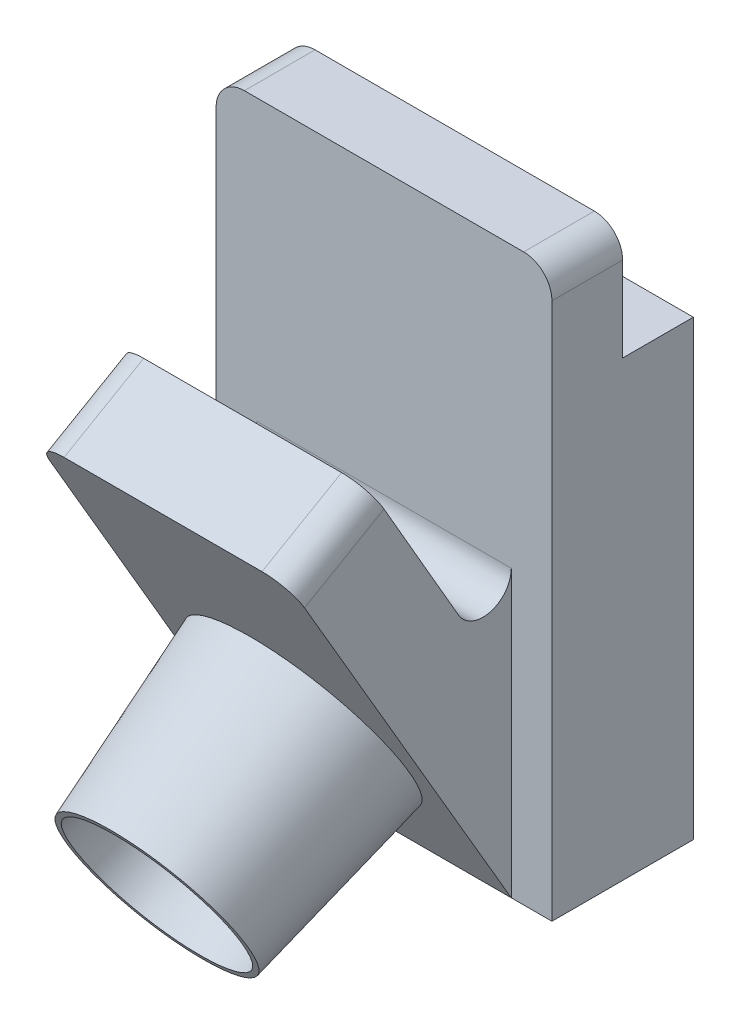
ISO-10303-21;
HEADER;
FILE_DESCRIPTION(('STEP AP214'),'2;1');
FILE_NAME('part.step','',(''),(''),'','','');
FILE_SCHEMA(('AUTOMOTIVE_DESIGN { 1 0 10303 214 1 1 1 1 }'));
ENDSEC;
DATA;
#1=APPLICATION_CONTEXT('core data for automotive mechanical design processes');
#2=APPLICATION_PROTOCOL_DEFINITION('international standard','automotive_design',2000,#1);
#3=PRODUCT_CONTEXT('',#1,'mechanical');
#4=PRODUCT('Part','Part','',(#3));
#5=PRODUCT_RELATED_PRODUCT_CATEGORY('part','',(#4));
#6=PRODUCT_DEFINITION_FORMATION('','',#4);
#7=PRODUCT_DEFINITION_CONTEXT('part definition',#1,'design');
#8=PRODUCT_DEFINITION('design','',#6,#7);
#9=PRODUCT_DEFINITION_SHAPE('','',#8);
#10=(LENGTH_UNIT() NAMED_UNIT(*) SI_UNIT(.MILLI.,.METRE.));
#11=(NAMED_UNIT(*) PLANE_ANGLE_UNIT() SI_UNIT($,.RADIAN.));
#12=(NAMED_UNIT(*) SI_UNIT($,.STERADIAN.) SOLID_ANGLE_UNIT());
#13=UNCERTAINTY_MEASURE_WITH_UNIT(LENGTH_MEASURE(1.E-05),#10,'distance_accuracy_value','');
#14=(GEOMETRIC_REPRESENTATION_CONTEXT(3) GLOBAL_UNCERTAINTY_ASSIGNED_CONTEXT((#13)) GLOBAL_UNIT_ASSIGNED_CONTEXT((#10,
#11,#12)) REPRESENTATION_CONTEXT('',''));
#15=CARTESIAN_POINT('',(0.,0.,0.));
#16=DIRECTION('',(0.,0.,1.));
#17=DIRECTION('',(1.,0.,0.));
#18=AXIS2_PLACEMENT_3D('',#15,#16,#17);
#19=CARTESIAN_POINT('',(0.,0.,5.));
#20=DIRECTION('',(0.,0.,-1.));
#21=DIRECTION('',(-1.,0.,0.));
#22=AXIS2_PLACEMENT_3D('',#19,#20,#21);
#23=PLANE('',#22);
#24=DIRECTION('',(1.,0.,0.));
#25=VECTOR('',#24,1.);
#26=CARTESIAN_POINT('',(0.,4.18632312078236,5.));
#27=LINE('',#26,#25);
#28=CARTESIAN_POINT('',(-9.,4.18632312078236,5.));
#29=VERTEX_POINT('',#28);
#30=CARTESIAN_POINT('',(9.,4.18632312078236,5.));
#31=VERTEX_POINT('',#30);
#32=EDGE_CURVE('E237',#29,#31,#27,.T.);
#33=ORIENTED_EDGE('',*,*,#32,.T.);
#34=DIRECTION('',(0.,1.,0.));
#35=VECTOR('',#34,1.);
#36=CARTESIAN_POINT('',(9.,-16.,5.));
#37=LINE('',#36,#35);
#38=CARTESIAN_POINT('',(9.,-16.,5.));
#39=VERTEX_POINT('',#38);
#40=EDGE_CURVE('E163',#39,#31,#37,.T.);
#41=ORIENTED_EDGE('',*,*,#40,.F.);
#42=DIRECTION('',(1.,0.,0.));
#43=VECTOR('',#42,1.);
#44=CARTESIAN_POINT('',(-11.875,-16.,5.));
#45=LINE('',#44,#43);
#46=CARTESIAN_POINT('',(11.875,-16.,5.));
#47=VERTEX_POINT('',#46);
#48=EDGE_CURVE('E190',#39,#47,#45,.T.);
#49=ORIENTED_EDGE('',*,*,#48,.T.);
#50=DIRECTION('',(0.,1.,0.));
#51=VECTOR('',#50,1.);
#52=CARTESIAN_POINT('',(11.875,-16.,5.));
#53=LINE('',#52,#51);
#54=CARTESIAN_POINT('',(11.875,22.,5.));
#55=VERTEX_POINT('',#54);
#56=EDGE_CURVE('E195',#47,#55,#53,.T.);
#57=ORIENTED_EDGE('',*,*,#56,.T.);
#58=CARTESIAN_POINT('',(9.875,22.,5.));
#59=DIRECTION('',(0.,0.,-1.));
#60=DIRECTION('',(-1.,0.,0.));
#61=AXIS2_PLACEMENT_3D('',#58,#59,#60);
#62=CIRCLE('',#61,2.);
#63=CARTESIAN_POINT('',(9.875,24.,5.));
#64=VERTEX_POINT('',#63);
#65=EDGE_CURVE('E226',#55,#64,#62,.F.);
#66=ORIENTED_EDGE('',*,*,#65,.T.);
#67=DIRECTION('',(-1.,0.,0.));
#68=VECTOR('',#67,1.);
#69=CARTESIAN_POINT('',(-11.875,24.,5.));
#70=LINE('',#69,#68);
#71=CARTESIAN_POINT('',(-9.875,24.,5.));
#72=VERTEX_POINT('',#71);
#73=EDGE_CURVE('E198',#64,#72,#70,.T.);
#74=ORIENTED_EDGE('',*,*,#73,.T.);
#75=CARTESIAN_POINT('',(-9.875,22.,5.));
#76=DIRECTION('',(0.,0.,-1.));
#77=DIRECTION('',(-1.,0.,0.));
#78=AXIS2_PLACEMENT_3D('',#75,#76,#77);
#79=CIRCLE('',#78,2.);
#80=CARTESIAN_POINT('',(-11.875,22.,5.));
#81=VERTEX_POINT('',#80);
#82=EDGE_CURVE('E235',#72,#81,#79,.F.);
#83=ORIENTED_EDGE('',*,*,#82,.T.);
#84=DIRECTION('',(0.,-1.,0.));
#85=VECTOR('',#84,1.);
#86=CARTESIAN_POINT('',(-11.875,-16.,5.));
#87=LINE('',#86,#85);
#88=CARTESIAN_POINT('',(-11.875,-16.,5.));
#89=VERTEX_POINT('',#88);
#90=EDGE_CURVE('E188',#81,#89,#87,.T.);
#91=ORIENTED_EDGE('',*,*,#90,.T.);
#92=CARTESIAN_POINT('',(-9.,-16.,5.));
#93=VERTEX_POINT('',#92);
#94=EDGE_CURVE('E192',#89,#93,#45,.T.);
#95=ORIENTED_EDGE('',*,*,#94,.T.);
#96=DIRECTION('',(0.,1.,0.));
#97=VECTOR('',#96,1.);
#98=CARTESIAN_POINT('',(-9.,-16.,5.));
#99=LINE('',#98,#97);
#100=EDGE_CURVE('E165',#93,#29,#99,.T.);
#101=ORIENTED_EDGE('',*,*,#100,.T.);
#102=EDGE_LOOP('',(#33,#41,#49,#57,#66,#74,#83,#91,#95,#101));
#103=FACE_BOUND('',#102,.T.);
#104=ADVANCED_FACE('F34',(#103),#23,.F.);
#105=CARTESIAN_POINT('',(-11.875,16.,-5.));
#106=DIRECTION('',(-1.,0.,0.));
#107=DIRECTION('',(0.,-1.,0.));
#108=AXIS2_PLACEMENT_3D('',#105,#106,#107);
#109=PLANE('',#108);
#110=ORIENTED_EDGE('',*,*,#90,.F.);
#111=DIRECTION('',(0.,0.,-1.));
#112=VECTOR('',#111,1.);
#113=CARTESIAN_POINT('',(-11.875,22.,0.));
#114=LINE('',#113,#112);
#115=CARTESIAN_POINT('',(-11.875,22.,0.));
#116=VERTEX_POINT('',#115);
#117=EDGE_CURVE('E246',#81,#116,#114,.T.);
#118=ORIENTED_EDGE('',*,*,#117,.T.);
#119=DIRECTION('',(0.,-1.,0.));
#120=VECTOR('',#119,1.);
#121=CARTESIAN_POINT('',(-11.875,-16.,0.));
#122=LINE('',#121,#120);
#123=CARTESIAN_POINT('',(-11.875,16.,0.));
#124=VERTEX_POINT('',#123);
#125=EDGE_CURVE('E182',#116,#124,#122,.T.);
#126=ORIENTED_EDGE('',*,*,#125,.T.);
#127=DIRECTION('',(0.,0.,1.));
#128=VECTOR('',#127,1.);
#129=CARTESIAN_POINT('',(-11.875,16.,-5.));
#130=LINE('',#129,#128);
#131=CARTESIAN_POINT('',(-11.875,16.,-5.));
#132=VERTEX_POINT('',#131);
#133=EDGE_CURVE('E223',#132,#124,#130,.T.);
#134=ORIENTED_EDGE('',*,*,#133,.F.);
#135=DIRECTION('',(0.,-1.,0.));
#136=VECTOR('',#135,1.);
#137=CARTESIAN_POINT('',(-11.875,16.,-5.));
#138=LINE('',#137,#136);
#139=CARTESIAN_POINT('',(-11.875,-16.,-5.));
#140=VERTEX_POINT('',#139);
#141=EDGE_CURVE('E208',#132,#140,#138,.T.);
#142=ORIENTED_EDGE('',*,*,#141,.T.);
#143=DIRECTION('',(0.,0.,1.));
#144=VECTOR('',#143,1.);
#145=CARTESIAN_POINT('',(-11.875,-16.,-5.));
#146=LINE('',#145,#144);
#147=EDGE_CURVE('E220',#140,#89,#146,.T.);
#148=ORIENTED_EDGE('',*,*,#147,.T.);
#149=EDGE_LOOP('',(#110,#118,#126,#134,#142,#148));
#150=FACE_BOUND('',#149,.T.);
#151=ADVANCED_FACE('F303',(#150),#109,.T.);
#152=CARTESIAN_POINT('',(11.875,16.,-5.));
#153=DIRECTION('',(0.,1.,0.));
#154=DIRECTION('',(0.,0.,1.));
#155=AXIS2_PLACEMENT_3D('',#152,#153,#154);
#156=PLANE('',#155);
#157=DIRECTION('',(-1.,0.,0.));
#158=VECTOR('',#157,1.);
#159=CARTESIAN_POINT('',(11.875,16.,0.));
#160=LINE('',#159,#158);
#161=CARTESIAN_POINT('',(11.875,16.,0.));
#162=VERTEX_POINT('',#161);
#163=EDGE_CURVE('E201',#162,#124,#160,.T.);
#164=ORIENTED_EDGE('',*,*,#163,.F.);
#165=DIRECTION('',(0.,0.,1.));
#166=VECTOR('',#165,1.);
#167=CARTESIAN_POINT('',(11.875,16.,-5.));
#168=LINE('',#167,#166);
#169=CARTESIAN_POINT('',(11.875,16.,-5.));
#170=VERTEX_POINT('',#169);
#171=EDGE_CURVE('E227',#170,#162,#168,.T.);
#172=ORIENTED_EDGE('',*,*,#171,.F.);
#173=DIRECTION('',(-1.,0.,0.));
#174=VECTOR('',#173,1.);
#175=CARTESIAN_POINT('',(11.875,16.,-5.));
#176=LINE('',#175,#174);
#177=EDGE_CURVE('E217',#170,#132,#176,.T.);
#178=ORIENTED_EDGE('',*,*,#177,.T.);
#179=ORIENTED_EDGE('',*,*,#133,.T.);
#180=EDGE_LOOP('',(#164,#172,#178,#179));
#181=FACE_BOUND('',#180,.T.);
#182=ADVANCED_FACE('F309',(#181),#156,.T.);
#183=CARTESIAN_POINT('',(11.875,16.,-5.));
#184=DIRECTION('',(1.,0.,0.));
#185=DIRECTION('',(0.,1.,0.));
#186=AXIS2_PLACEMENT_3D('',#183,#184,#185);
#187=PLANE('',#186);
#188=DIRECTION('',(0.,1.,0.));
#189=VECTOR('',#188,1.);
#190=CARTESIAN_POINT('',(11.875,-16.,0.));
#191=LINE('',#190,#189);
#192=CARTESIAN_POINT('',(11.875,22.,0.));
#193=VERTEX_POINT('',#192);
#194=EDGE_CURVE('E203',#162,#193,#191,.T.);
#195=ORIENTED_EDGE('',*,*,#194,.T.);
#196=DIRECTION('',(0.,0.,-1.));
#197=VECTOR('',#196,1.);
#198=CARTESIAN_POINT('',(11.875,22.,5.));
#199=LINE('',#198,#197);
#200=EDGE_CURVE('E258',#193,#55,#199,.F.);
#201=ORIENTED_EDGE('',*,*,#200,.T.);
#202=ORIENTED_EDGE('',*,*,#56,.F.);
#203=DIRECTION('',(0.,0.,1.));
#204=VECTOR('',#203,1.);
#205=CARTESIAN_POINT('',(11.875,-16.,-5.));
#206=LINE('',#205,#204);
#207=CARTESIAN_POINT('',(11.875,-16.,-5.));
#208=VERTEX_POINT('',#207);
#209=EDGE_CURVE('E229',#208,#47,#206,.T.);
#210=ORIENTED_EDGE('',*,*,#209,.F.);
#211=DIRECTION('',(0.,1.,0.));
#212=VECTOR('',#211,1.);
#213=CARTESIAN_POINT('',(11.875,16.,-5.));
#214=LINE('',#213,#212);
#215=EDGE_CURVE('E214',#208,#170,#214,.T.);
#216=ORIENTED_EDGE('',*,*,#215,.T.);
#217=ORIENTED_EDGE('',*,*,#171,.T.);
#218=EDGE_LOOP('',(#195,#201,#202,#210,#216,#217));
#219=FACE_BOUND('',#218,.T.);
#220=ADVANCED_FACE('F330',(#219),#187,.T.);
#221=CARTESIAN_POINT('',(11.875,-16.,-5.));
#222=DIRECTION('',(0.,-1.,0.));
#223=DIRECTION('',(0.,0.,-1.));
#224=AXIS2_PLACEMENT_3D('',#221,#222,#223);
#225=PLANE('',#224);
#226=ORIENTED_EDGE('',*,*,#209,.T.);
#227=ORIENTED_EDGE('',*,*,#48,.F.);
#228=DIRECTION('',(1.,0.,0.));
#229=VECTOR('',#228,1.);
#230=CARTESIAN_POINT('',(-9.,-16.,5.));
#231=LINE('',#230,#229);
#232=EDGE_CURVE('E179',#93,#39,#231,.T.);
#233=ORIENTED_EDGE('',*,*,#232,.F.);
#234=ORIENTED_EDGE('',*,*,#94,.F.);
#235=ORIENTED_EDGE('',*,*,#147,.F.);
#236=DIRECTION('',(1.,0.,0.));
#237=VECTOR('',#236,1.);
#238=CARTESIAN_POINT('',(11.875,-16.,-5.));
#239=LINE('',#238,#237);
#240=EDGE_CURVE('E211',#140,#208,#239,.T.);
#241=ORIENTED_EDGE('',*,*,#240,.T.);
#242=EDGE_LOOP('',(#226,#227,#233,#234,#235,#241));
#243=FACE_BOUND('',#242,.T.);
#244=ADVANCED_FACE('F326',(#243),#225,.T.);
#245=CARTESIAN_POINT('',(0.,0.,-5.));
#246=DIRECTION('',(0.,0.,-1.));
#247=DIRECTION('',(-1.,0.,0.));
#248=AXIS2_PLACEMENT_3D('',#245,#246,#247);
#249=PLANE('',#248);
#250=ORIENTED_EDGE('',*,*,#141,.F.);
#251=ORIENTED_EDGE('',*,*,#177,.F.);
#252=ORIENTED_EDGE('',*,*,#215,.F.);
#253=ORIENTED_EDGE('',*,*,#240,.F.);
#254=EDGE_LOOP('',(#250,#251,#252,#253));
#255=FACE_BOUND('',#254,.T.);
#256=ADVANCED_FACE('F322',(#255),#249,.T.);
#257=CARTESIAN_POINT('',(-11.875,24.,5.));
#258=DIRECTION('',(0.,-1.,0.));
#259=DIRECTION('',(0.,0.,-1.));
#260=AXIS2_PLACEMENT_3D('',#257,#258,#259);
#261=PLANE('',#260);
#262=DIRECTION('',(-1.,0.,0.));
#263=VECTOR('',#262,1.);
#264=CARTESIAN_POINT('',(-11.875,24.,0.));
#265=LINE('',#264,#263);
#266=CARTESIAN_POINT('',(9.875,24.,0.));
#267=VERTEX_POINT('',#266);
#268=CARTESIAN_POINT('',(-9.875,24.,0.));
#269=VERTEX_POINT('',#268);
#270=EDGE_CURVE('E191',#267,#269,#265,.T.);
#271=ORIENTED_EDGE('',*,*,#270,.T.);
#272=DIRECTION('',(0.,0.,-1.));
#273=VECTOR('',#272,1.);
#274=CARTESIAN_POINT('',(-9.875,24.,5.));
#275=LINE('',#274,#273);
#276=EDGE_CURVE('E256',#269,#72,#275,.F.);
#277=ORIENTED_EDGE('',*,*,#276,.T.);
#278=ORIENTED_EDGE('',*,*,#73,.F.);
#279=DIRECTION('',(0.,0.,-1.));
#280=VECTOR('',#279,1.);
#281=CARTESIAN_POINT('',(9.875,24.,0.));
#282=LINE('',#281,#280);
#283=EDGE_CURVE('E253',#64,#267,#282,.T.);
#284=ORIENTED_EDGE('',*,*,#283,.T.);
#285=EDGE_LOOP('',(#271,#277,#278,#284));
#286=FACE_BOUND('',#285,.T.);
#287=ADVANCED_FACE('F318',(#286),#261,.F.);
#288=CARTESIAN_POINT('',(0.,0.,0.));
#289=DIRECTION('',(0.,0.,-1.));
#290=DIRECTION('',(-1.,0.,0.));
#291=AXIS2_PLACEMENT_3D('',#288,#289,#290);
#292=PLANE('',#291);
#293=ORIENTED_EDGE('',*,*,#125,.F.);
#294=CARTESIAN_POINT('',(-9.875,22.,0.));
#295=DIRECTION('',(0.,0.,-1.));
#296=DIRECTION('',(-1.,0.,0.));
#297=AXIS2_PLACEMENT_3D('',#294,#295,#296);
#298=CIRCLE('',#297,2.);
#299=EDGE_CURVE('E251',#116,#269,#298,.T.);
#300=ORIENTED_EDGE('',*,*,#299,.T.);
#301=ORIENTED_EDGE('',*,*,#270,.F.);
#302=CARTESIAN_POINT('',(9.875,22.,0.));
#303=DIRECTION('',(0.,0.,-1.));
#304=DIRECTION('',(-1.,0.,0.));
#305=AXIS2_PLACEMENT_3D('',#302,#303,#304);
#306=CIRCLE('',#305,2.);
#307=EDGE_CURVE('E249',#267,#193,#306,.T.);
#308=ORIENTED_EDGE('',*,*,#307,.T.);
#309=ORIENTED_EDGE('',*,*,#194,.F.);
#310=ORIENTED_EDGE('',*,*,#163,.T.);
#311=EDGE_LOOP('',(#293,#300,#301,#308,#309,#310));
#312=FACE_BOUND('',#311,.T.);
#313=ADVANCED_FACE('F315',(#312),#292,.T.);
#314=CARTESIAN_POINT('',(-9.,10.7927295813334,20.6291651245988));
#315=DIRECTION('',(0.,-0.50387277832175,0.863777878430746));
#316=DIRECTION('',(0.,-0.863777878430746,-0.50387277832175));
#317=AXIS2_PLACEMENT_3D('',#314,#315,#316);
#318=PLANE('',#317);
#319=CARTESIAN_POINT('',(0.,-6.2383752250277,10.6943076676559));
#320=DIRECTION('',(0.,-0.50387277832175,0.863777878430746));
#321=DIRECTION('',(0.,-0.863777878430746,-0.50387277832175));
#322=AXIS2_PLACEMENT_3D('',#319,#320,#321);
#323=CIRCLE('',#322,7.5);
#324=CARTESIAN_POINT('',(0.,-12.7167093132583,6.91526183024274));
#325=VERTEX_POINT('',#324);
#326=EDGE_CURVE('E156',#325,#325,#323,.T.);
#327=ORIENTED_EDGE('',*,*,#326,.F.);
#328=EDGE_LOOP('',(#327));
#329=FACE_BOUND('',#328,.T.);
#330=DIRECTION('',(1.,0.,0.));
#331=VECTOR('',#330,1.);
#332=CARTESIAN_POINT('',(-9.,10.7927295813334,20.6291651245988));
#333=LINE('',#332,#331);
#334=CARTESIAN_POINT('',(-7.,10.7927295813334,20.6291651245988));
#335=VERTEX_POINT('',#334);
#336=CARTESIAN_POINT('',(7.,10.7927295813334,20.6291651245988));
#337=VERTEX_POINT('',#336);
#338=EDGE_CURVE('E183',#335,#337,#333,.T.);
#339=ORIENTED_EDGE('',*,*,#338,.F.);
#340=CARTESIAN_POINT('',(-7.,9.06515650573998,19.6214094653146));
#341=DIRECTION('',(0.,-0.50387277832175,0.863777878430746));
#342=DIRECTION('',(0.,-0.863777878430746,-0.50387277832175));
#343=AXIS2_PLACEMENT_3D('',#340,#341,#342);
#344=ELLIPSE('',#343,2.00002004998314,2.);
#345=CARTESIAN_POINT('',(-9.,9.06515650573998,19.6214094653146));
#346=VERTEX_POINT('',#345);
#347=EDGE_CURVE('E49',#335,#346,#344,.T.);
#348=ORIENTED_EDGE('',*,*,#347,.T.);
#349=DIRECTION('',(0.,-0.863777878430746,-0.50387277832175));
#350=VECTOR('',#349,1.);
#351=CARTESIAN_POINT('',(-9.,10.7927295813334,20.6291651245988));
#352=LINE('',#351,#350);
#353=EDGE_CURVE('E171',#346,#93,#352,.T.);
#354=ORIENTED_EDGE('',*,*,#353,.T.);
#355=ORIENTED_EDGE('',*,*,#232,.T.);
#356=DIRECTION('',(0.,-0.863777878430746,-0.50387277832175));
#357=VECTOR('',#356,1.);
#358=CARTESIAN_POINT('',(9.,10.7927295813334,20.6291651245988));
#359=LINE('',#358,#357);
#360=CARTESIAN_POINT('',(9.,9.06515650573998,19.6214094653146));
#361=VERTEX_POINT('',#360);
#362=EDGE_CURVE('E168',#361,#39,#359,.T.);
#363=ORIENTED_EDGE('',*,*,#362,.F.);
#364=CARTESIAN_POINT('',(7.,9.06515650573998,19.6214094653146));
#365=DIRECTION('',(0.,-0.50387277832175,0.863777878430746));
#366=DIRECTION('',(0.,0.863777878430746,0.50387277832175));
#367=AXIS2_PLACEMENT_3D('',#364,#365,#366);
#368=ELLIPSE('',#367,2.00002004998314,2.);
#369=EDGE_CURVE('E57',#361,#337,#368,.T.);
#370=ORIENTED_EDGE('',*,*,#369,.T.);
#371=EDGE_LOOP('',(#339,#348,#354,#355,#363,#370));
#372=FACE_BOUND('',#371,.T.);
#373=ADVANCED_FACE('F295',(#329,#372),#318,.T.);
#374=CARTESIAN_POINT('',(-9.,14.0427295813334,15.));
#375=DIRECTION('',(0.,0.86602540378444,0.499999999999998));
#376=DIRECTION('',(0.,-0.499999999999998,0.86602540378444));
#377=AXIS2_PLACEMENT_3D('',#374,#375,#376);
#378=PLANE('',#377);
#379=DIRECTION('',(1.,0.,0.));
#380=VECTOR('',#379,1.);
#381=CARTESIAN_POINT('',(-9.,14.0427295813334,15.));
#382=LINE('',#381,#380);
#383=CARTESIAN_POINT('',(-7.,14.0427295813334,15.));
#384=VERTEX_POINT('',#383);
#385=CARTESIAN_POINT('',(7.,14.0427295813334,15.));
#386=VERTEX_POINT('',#385);
#387=EDGE_CURVE('E173',#384,#386,#382,.T.);
#388=ORIENTED_EDGE('',*,*,#387,.F.);
#389=DIRECTION('',(0.,-0.499999999999998,0.86602540378444));
#390=VECTOR('',#389,1.);
#391=CARTESIAN_POINT('',(-7.,10.7927295813334,20.6291651245988));
#392=LINE('',#391,#390);
#393=EDGE_CURVE('E262',#384,#335,#392,.T.);
#394=ORIENTED_EDGE('',*,*,#393,.T.);
#395=ORIENTED_EDGE('',*,*,#338,.T.);
#396=DIRECTION('',(0.,-0.499999999999998,0.86602540378444));
#397=VECTOR('',#396,1.);
#398=CARTESIAN_POINT('',(7.,14.0427295813334,15.));
#399=LINE('',#398,#397);
#400=EDGE_CURVE('E260',#337,#386,#399,.F.);
#401=ORIENTED_EDGE('',*,*,#400,.T.);
#402=EDGE_LOOP('',(#388,#394,#395,#401));
#403=FACE_BOUND('',#402,.T.);
#404=ADVANCED_FACE('F294',(#403),#378,.T.);
#405=CARTESIAN_POINT('',(-9.,-3.27777849435543,5.));
#406=DIRECTION('',(0.,0.499999999999998,-0.86602540378444));
#407=DIRECTION('',(0.,0.86602540378444,0.499999999999998));
#408=AXIS2_PLACEMENT_3D('',#405,#406,#407);
#409=PLANE('',#408);
#410=DIRECTION('',(0.,0.86602540378444,0.499999999999998));
#411=VECTOR('',#410,1.);
#412=CARTESIAN_POINT('',(9.,-3.27777849435543,5.));
#413=LINE('',#412,#411);
#414=CARTESIAN_POINT('',(9.,3.18632312078236,8.73205080756888));
#415=VERTEX_POINT('',#414);
#416=CARTESIAN_POINT('',(9.,12.3106787737645,14.));
#417=VERTEX_POINT('',#416);
#418=EDGE_CURVE('E175',#415,#417,#413,.T.);
#419=ORIENTED_EDGE('',*,*,#418,.F.);
#420=DIRECTION('',(1.,0.,0.));
#421=VECTOR('',#420,1.);
#422=CARTESIAN_POINT('',(-9.,3.18632312078236,8.73205080756888));
#423=LINE('',#422,#421);
#424=CARTESIAN_POINT('',(-9.,3.18632312078236,8.73205080756888));
#425=VERTEX_POINT('',#424);
#426=EDGE_CURVE('E244',#415,#425,#423,.F.);
#427=ORIENTED_EDGE('',*,*,#426,.T.);
#428=DIRECTION('',(0.,0.86602540378444,0.499999999999998));
#429=VECTOR('',#428,1.);
#430=CARTESIAN_POINT('',(-9.,-3.27777849435543,5.));
#431=LINE('',#430,#429);
#432=CARTESIAN_POINT('',(-9.,12.3106787737645,14.));
#433=VERTEX_POINT('',#432);
#434=EDGE_CURVE('E167',#425,#433,#431,.T.);
#435=ORIENTED_EDGE('',*,*,#434,.T.);
#436=CARTESIAN_POINT('',(-7.,12.3106787737645,14.));
#437=DIRECTION('',(0.,0.499999999999998,-0.86602540378444));
#438=DIRECTION('',(0.,0.86602540378444,0.499999999999998));
#439=AXIS2_PLACEMENT_3D('',#436,#437,#438);
#440=CIRCLE('',#439,2.);
#441=EDGE_CURVE('E242',#433,#384,#440,.T.);
#442=ORIENTED_EDGE('',*,*,#441,.T.);
#443=ORIENTED_EDGE('',*,*,#387,.T.);
#444=CARTESIAN_POINT('',(7.,12.3106787737645,14.));
#445=DIRECTION('',(0.,0.499999999999998,-0.86602540378444));
#446=DIRECTION('',(0.,0.86602540378444,0.499999999999998));
#447=AXIS2_PLACEMENT_3D('',#444,#445,#446);
#448=CIRCLE('',#447,2.);
#449=EDGE_CURVE('E240',#386,#417,#448,.T.);
#450=ORIENTED_EDGE('',*,*,#449,.T.);
#451=EDGE_LOOP('',(#419,#427,#435,#442,#443,#450));
#452=FACE_BOUND('',#451,.T.);
#453=ADVANCED_FACE('F279',(#452),#409,.T.);
#454=CARTESIAN_POINT('',(-9.,0.,0.));
#455=DIRECTION('',(1.,0.,0.));
#456=DIRECTION('',(0.,1.,0.));
#457=AXIS2_PLACEMENT_3D('',#454,#455,#456);
#458=PLANE('',#457);
#459=ORIENTED_EDGE('',*,*,#353,.F.);
#460=DIRECTION('',(0.,-0.499999999999998,0.86602540378444));
#461=VECTOR('',#460,1.);
#462=CARTESIAN_POINT('',(-9.,12.3106787737645,14.));
#463=LINE('',#462,#461);
#464=EDGE_CURVE('E267',#346,#433,#463,.F.);
#465=ORIENTED_EDGE('',*,*,#464,.T.);
#466=ORIENTED_EDGE('',*,*,#434,.F.);
#467=CARTESIAN_POINT('',(-9.,4.18632312078235,7.));
#468=DIRECTION('',(1.,0.,0.));
#469=DIRECTION('',(0.,1.,0.));
#470=AXIS2_PLACEMENT_3D('',#467,#468,#469);
#471=CIRCLE('',#470,2.);
#472=EDGE_CURVE('E11',#425,#29,#471,.T.);
#473=ORIENTED_EDGE('',*,*,#472,.T.);
#474=ORIENTED_EDGE('',*,*,#100,.F.);
#475=EDGE_LOOP('',(#459,#465,#466,#473,#474));
#476=FACE_BOUND('',#475,.T.);
#477=ADVANCED_FACE('F285',(#476),#458,.F.);
#478=CARTESIAN_POINT('',(9.,0.,0.));
#479=DIRECTION('',(1.,0.,0.));
#480=DIRECTION('',(0.,1.,0.));
#481=AXIS2_PLACEMENT_3D('',#478,#479,#480);
#482=PLANE('',#481);
#483=ORIENTED_EDGE('',*,*,#418,.T.);
#484=DIRECTION('',(0.,-0.499999999999998,0.86602540378444));
#485=VECTOR('',#484,1.);
#486=CARTESIAN_POINT('',(9.,15.2951869068144,8.8306802779549));
#487=LINE('',#486,#485);
#488=EDGE_CURVE('E269',#417,#361,#487,.T.);
#489=ORIENTED_EDGE('',*,*,#488,.T.);
#490=ORIENTED_EDGE('',*,*,#362,.T.);
#491=ORIENTED_EDGE('',*,*,#40,.T.);
#492=CARTESIAN_POINT('',(9.,4.18632312078236,7.));
#493=DIRECTION('',(1.,0.,0.));
#494=DIRECTION('',(0.,1.,0.));
#495=AXIS2_PLACEMENT_3D('',#492,#493,#494);
#496=CIRCLE('',#495,2.);
#497=EDGE_CURVE('E42',#31,#415,#496,.F.);
#498=ORIENTED_EDGE('',*,*,#497,.T.);
#499=EDGE_LOOP('',(#483,#489,#490,#491,#498));
#500=FACE_BOUND('',#499,.T.);
#501=ADVANCED_FACE('F273',(#500),#482,.T.);
#502=CARTESIAN_POINT('',(0.,-12.2848485648887,21.0596422088248));
#503=DIRECTION('',(0.,-0.50387277832175,0.863777878430746));
#504=DIRECTION('',(0.,-0.863777878430746,-0.50387277832175));
#505=AXIS2_PLACEMENT_3D('',#502,#503,#504);
#506=PLANE('',#505);
#507=CARTESIAN_POINT('',(0.,-12.2848485648887,21.0596422088248));
#508=DIRECTION('',(0.,-0.50387277832175,0.863777878430746));
#509=DIRECTION('',(0.,-0.863777878430746,-0.50387277832175));
#510=AXIS2_PLACEMENT_3D('',#507,#508,#509);
#511=CIRCLE('',#510,6.45013603768891);
#512=CARTESIAN_POINT('',(0.,-17.8563333871133,17.8095942429613));
#513=VERTEX_POINT('',#512);
#514=EDGE_CURVE('E161',#513,#513,#511,.T.);
#515=ORIENTED_EDGE('',*,*,#514,.T.);
#516=EDGE_LOOP('',(#515));
#517=FACE_BOUND('',#516,.T.);
#518=CARTESIAN_POINT('',(0.,-12.2848485648887,21.0596422088248));
#519=DIRECTION('',(0.,-0.50387277832175,0.863777878430746));
#520=DIRECTION('',(0.,-0.863777878430746,-0.50387277832175));
#521=AXIS2_PLACEMENT_3D('',#518,#519,#520);
#522=CIRCLE('',#521,6.04986396231109);
#523=CARTESIAN_POINT('',(0.,-17.5105872230484,18.0112804456665));
#524=VERTEX_POINT('',#523);
#525=EDGE_CURVE('E153',#524,#524,#522,.T.);
#526=ORIENTED_EDGE('',*,*,#525,.F.);
#527=EDGE_LOOP('',(#526));
#528=FACE_BOUND('',#527,.T.);
#529=ADVANCED_FACE('F414',(#517,#528),#506,.T.);
#530=CARTESIAN_POINT('',(0.,-6.2383752250277,10.6943076676559));
#531=DIRECTION('',(0.,0.50387277832175,-0.863777878430746));
#532=DIRECTION('',(0.,-0.863777878430746,-0.50387277832175));
#533=AXIS2_PLACEMENT_3D('',#530,#531,#532);
#534=CONICAL_SURFACE('',#533,7.5,0.0872664625997165);
#535=ORIENTED_EDGE('',*,*,#514,.F.);
#536=EDGE_LOOP('',(#535));
#537=FACE_BOUND('',#536,.T.);
#538=ORIENTED_EDGE('',*,*,#326,.T.);
#539=EDGE_LOOP('',(#538));
#540=FACE_BOUND('',#539,.T.);
#541=ADVANCED_FACE('F405',(#537,#540),#534,.T.);
#542=CARTESIAN_POINT('',(0.,-6.2383752250277,10.6943076676559));
#543=DIRECTION('',(0.,-0.50387277832175,0.863777878430746));
#544=DIRECTION('',(0.,-0.863777878430746,-0.50387277832175));
#545=AXIS2_PLACEMENT_3D('',#542,#543,#544);
#546=CONICAL_SURFACE('',#545,5.,0.0872664625997165);
#547=ORIENTED_EDGE('',*,*,#525,.T.);
#548=EDGE_LOOP('',(#547));
#549=FACE_BOUND('',#548,.T.);
#550=CARTESIAN_POINT('',(0.,-6.2383752250277,10.6943076676559));
#551=DIRECTION('',(0.,-0.50387277832175,0.863777878430746));
#552=DIRECTION('',(0.,-0.863777878430746,-0.50387277832175));
#553=AXIS2_PLACEMENT_3D('',#550,#551,#552);
#554=CIRCLE('',#553,5.);
#555=CARTESIAN_POINT('',(0.,-10.5572646171814,8.17494377604711));
#556=VERTEX_POINT('',#555);
#557=EDGE_CURVE('E151',#556,#556,#554,.T.);
#558=ORIENTED_EDGE('',*,*,#557,.F.);
#559=EDGE_LOOP('',(#558));
#560=FACE_BOUND('',#559,.T.);
#561=ADVANCED_FACE('F147',(#549,#560),#546,.F.);
#562=CARTESIAN_POINT('',(0.,-6.2383752250277,10.6943076676559));
#563=DIRECTION('',(0.,0.50387277832175,-0.863777878430746));
#564=DIRECTION('',(0.,-0.863777878430746,-0.50387277832175));
#565=AXIS2_PLACEMENT_3D('',#562,#563,#564);
#566=CONICAL_SURFACE('',#565,5.,0.785398163397449);
#567=CARTESIAN_POINT('',(0.,-8.75773911663645,15.0131970598096));
#568=VERTEX_POINT('',#567);
#569=VERTEX_LOOP('',#568);
#570=FACE_BOUND('',#569,.T.);
#571=ORIENTED_EDGE('',*,*,#557,.T.);
#572=EDGE_LOOP('',(#571));
#573=FACE_BOUND('',#572,.T.);
#574=ADVANCED_FACE('F143',(#570,#573),#566,.T.);
#575=CARTESIAN_POINT('',(0.,4.18632312078236,7.));
#576=DIRECTION('',(1.,0.,0.));
#577=DIRECTION('',(0.,1.,0.));
#578=AXIS2_PLACEMENT_3D('',#575,#576,#577);
#579=CYLINDRICAL_SURFACE('',#578,2.);
#580=ORIENTED_EDGE('',*,*,#472,.F.);
#581=ORIENTED_EDGE('',*,*,#426,.F.);
#582=ORIENTED_EDGE('',*,*,#497,.F.);
#583=ORIENTED_EDGE('',*,*,#32,.F.);
#584=EDGE_LOOP('',(#580,#581,#582,#583));
#585=FACE_BOUND('',#584,.T.);
#586=ADVANCED_FACE('F146',(#585),#579,.F.);
#587=CARTESIAN_POINT('',(-9.875,22.,-5.));
#588=DIRECTION('',(0.,0.,1.));
#589=DIRECTION('',(1.,0.,0.));
#590=AXIS2_PLACEMENT_3D('',#587,#588,#589);
#591=CYLINDRICAL_SURFACE('',#590,2.);
#592=ORIENTED_EDGE('',*,*,#82,.F.);
#593=ORIENTED_EDGE('',*,*,#276,.F.);
#594=ORIENTED_EDGE('',*,*,#299,.F.);
#595=ORIENTED_EDGE('',*,*,#117,.F.);
#596=EDGE_LOOP('',(#592,#593,#594,#595));
#597=FACE_BOUND('',#596,.T.);
#598=ADVANCED_FACE('F340',(#597),#591,.T.);
#599=CARTESIAN_POINT('',(9.875,22.,5.));
#600=DIRECTION('',(0.,0.,1.));
#601=DIRECTION('',(1.,0.,0.));
#602=AXIS2_PLACEMENT_3D('',#599,#600,#601);
#603=CYLINDRICAL_SURFACE('',#602,2.);
#604=ORIENTED_EDGE('',*,*,#65,.F.);
#605=ORIENTED_EDGE('',*,*,#200,.F.);
#606=ORIENTED_EDGE('',*,*,#307,.F.);
#607=ORIENTED_EDGE('',*,*,#283,.F.);
#608=EDGE_LOOP('',(#604,#605,#606,#607));
#609=FACE_BOUND('',#608,.T.);
#610=ADVANCED_FACE('F301',(#609),#603,.T.);
#611=CARTESIAN_POINT('',(-7.,12.3106787737645,14.));
#612=DIRECTION('',(0.,0.499999999999998,-0.86602540378444));
#613=DIRECTION('',(0.,0.86602540378444,0.499999999999998));
#614=AXIS2_PLACEMENT_3D('',#611,#612,#613);
#615=CYLINDRICAL_SURFACE('',#614,2.);
#616=ORIENTED_EDGE('',*,*,#441,.F.);
#617=ORIENTED_EDGE('',*,*,#464,.F.);
#618=ORIENTED_EDGE('',*,*,#347,.F.);
#619=ORIENTED_EDGE('',*,*,#393,.F.);
#620=EDGE_LOOP('',(#616,#617,#618,#619));
#621=FACE_BOUND('',#620,.T.);
#622=ADVANCED_FACE('F292',(#621),#615,.T.);
#623=CARTESIAN_POINT('',(7.,15.2951869068144,8.8306802779549));
#624=DIRECTION('',(0.,-0.499999999999998,0.86602540378444));
#625=DIRECTION('',(0.,-0.86602540378444,-0.499999999999998));
#626=AXIS2_PLACEMENT_3D('',#623,#624,#625);
#627=CYLINDRICAL_SURFACE('',#626,2.);
#628=ORIENTED_EDGE('',*,*,#449,.F.);
#629=ORIENTED_EDGE('',*,*,#400,.F.);
#630=ORIENTED_EDGE('',*,*,#369,.F.);
#631=ORIENTED_EDGE('',*,*,#488,.F.);
#632=EDGE_LOOP('',(#628,#629,#630,#631));
#633=FACE_BOUND('',#632,.T.);
#634=ADVANCED_FACE('F36',(#633),#627,.T.);
#635=CLOSED_SHELL('',(#104,#151,#182,#220,#244,#256,#287,#313,#373,#404,#453,#477,#501,#529,
#541,#561,#574,#586,#598,#610,#622,#634));
#636=MANIFOLD_SOLID_BREP('B2',#635);
#637=ADVANCED_BREP_SHAPE_REPRESENTATION('',(#18,#636),#14);
#638=SHAPE_DEFINITION_REPRESENTATION(#9,#637);
ENDSEC;
END-ISO-10303-21;
